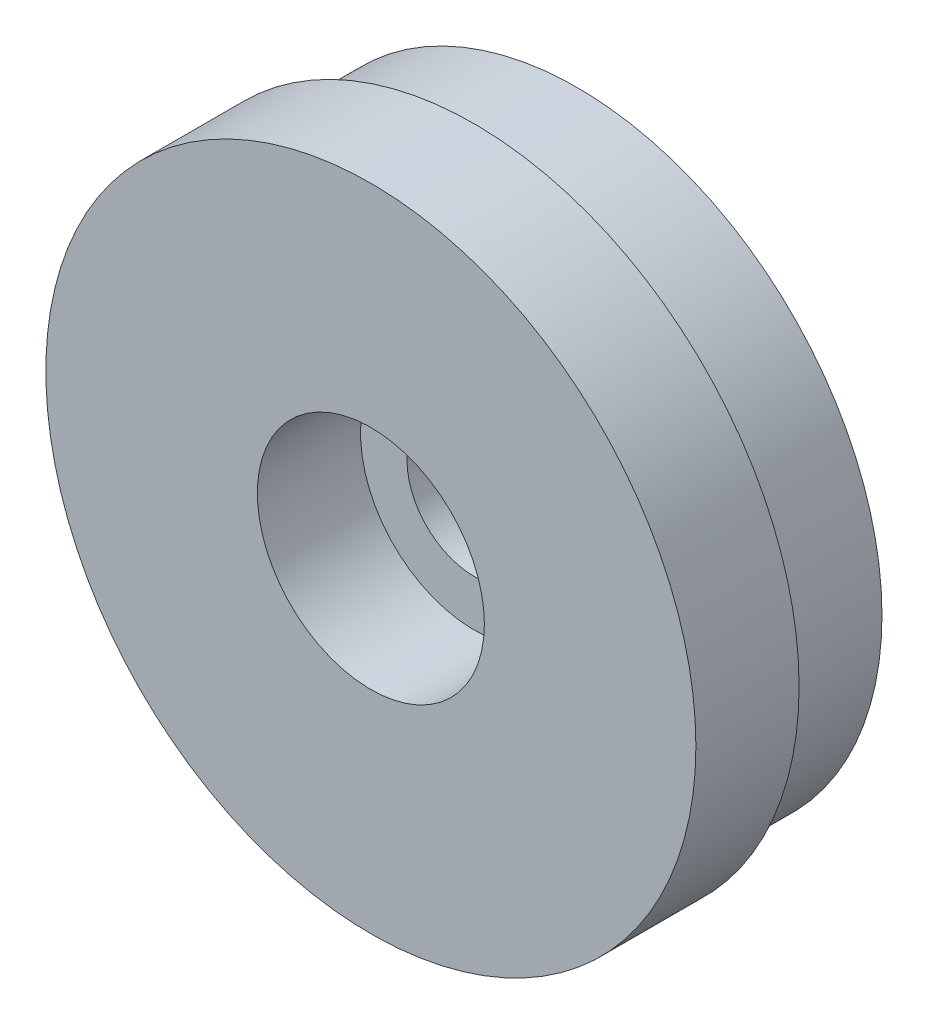
ISO-10303-21;
HEADER;
FILE_DESCRIPTION(('STEP AP214'),'2;1');
FILE_NAME('part.step','',(''),(''),'','','');
FILE_SCHEMA(('AUTOMOTIVE_DESIGN { 1 0 10303 214 1 1 1 1 }'));
ENDSEC;
DATA;
#1=APPLICATION_CONTEXT('core data for automotive mechanical design processes');
#2=APPLICATION_PROTOCOL_DEFINITION('international standard','automotive_design',2000,#1);
#3=PRODUCT_CONTEXT('',#1,'mechanical');
#4=PRODUCT('Part','Part','',(#3));
#5=PRODUCT_RELATED_PRODUCT_CATEGORY('part','',(#4));
#6=PRODUCT_DEFINITION_FORMATION('','',#4);
#7=PRODUCT_DEFINITION_CONTEXT('part definition',#1,'design');
#8=PRODUCT_DEFINITION('design','',#6,#7);
#9=PRODUCT_DEFINITION_SHAPE('','',#8);
#10=(LENGTH_UNIT() NAMED_UNIT(*) SI_UNIT(.MILLI.,.METRE.));
#11=(NAMED_UNIT(*) PLANE_ANGLE_UNIT() SI_UNIT($,.RADIAN.));
#12=(NAMED_UNIT(*) SI_UNIT($,.STERADIAN.) SOLID_ANGLE_UNIT());
#13=UNCERTAINTY_MEASURE_WITH_UNIT(LENGTH_MEASURE(1.E-05),#10,'distance_accuracy_value','');
#14=(GEOMETRIC_REPRESENTATION_CONTEXT(3) GLOBAL_UNCERTAINTY_ASSIGNED_CONTEXT((#13)) GLOBAL_UNIT_ASSIGNED_CONTEXT((#10,
#11,#12)) REPRESENTATION_CONTEXT('',''));
#15=CARTESIAN_POINT('',(0.,0.,0.));
#16=DIRECTION('',(0.,0.,1.));
#17=DIRECTION('',(1.,0.,0.));
#18=AXIS2_PLACEMENT_3D('',#15,#16,#17);
#19=CARTESIAN_POINT('',(0.,0.,-2.54));
#20=DIRECTION('',(0.,0.,1.));
#21=DIRECTION('',(1.,0.,0.));
#22=AXIS2_PLACEMENT_3D('',#19,#20,#21);
#23=CYLINDRICAL_SURFACE('',#22,8.);
#24=CARTESIAN_POINT('',(0.,0.,-2.54));
#25=DIRECTION('',(0.,0.,1.));
#26=DIRECTION('',(1.,0.,0.));
#27=AXIS2_PLACEMENT_3D('',#24,#25,#26);
#28=CIRCLE('',#27,8.);
#29=CARTESIAN_POINT('',(8.,0.,-2.54));
#30=VERTEX_POINT('',#29);
#31=EDGE_CURVE('E38',#30,#30,#28,.T.);
#32=ORIENTED_EDGE('',*,*,#31,.T.);
#33=EDGE_LOOP('',(#32));
#34=FACE_BOUND('',#33,.T.);
#35=CARTESIAN_POINT('',(0.,0.,0.));
#36=DIRECTION('',(0.,0.,1.));
#37=DIRECTION('',(1.,0.,0.));
#38=AXIS2_PLACEMENT_3D('',#35,#36,#37);
#39=CIRCLE('',#38,8.);
#40=CARTESIAN_POINT('',(8.,0.,0.));
#41=VERTEX_POINT('',#40);
#42=EDGE_CURVE('E34',#41,#41,#39,.T.);
#43=ORIENTED_EDGE('',*,*,#42,.F.);
#44=EDGE_LOOP('',(#43));
#45=FACE_BOUND('',#44,.T.);
#46=ADVANCED_FACE('F31',(#34,#45),#23,.T.);
#47=CARTESIAN_POINT('',(0.,0.,-2.54));
#48=DIRECTION('',(0.,0.,1.));
#49=DIRECTION('',(1.,0.,0.));
#50=AXIS2_PLACEMENT_3D('',#47,#48,#49);
#51=PLANE('',#50);
#52=CARTESIAN_POINT('',(0.,0.,-2.54));
#53=DIRECTION('',(0.,0.,-1.));
#54=DIRECTION('',(-1.,0.,0.));
#55=AXIS2_PLACEMENT_3D('',#52,#53,#54);
#56=CIRCLE('',#55,7.5);
#57=CARTESIAN_POINT('',(-7.5,0.,-2.54));
#58=VERTEX_POINT('',#57);
#59=EDGE_CURVE('E10',#58,#58,#56,.T.);
#60=ORIENTED_EDGE('',*,*,#59,.F.);
#61=EDGE_LOOP('',(#60));
#62=FACE_BOUND('',#61,.T.);
#63=ORIENTED_EDGE('',*,*,#31,.F.);
#64=EDGE_LOOP('',(#63));
#65=FACE_BOUND('',#64,.T.);
#66=ADVANCED_FACE('F81',(#62,#65),#51,.F.);
#67=CARTESIAN_POINT('',(0.,0.,0.));
#68=DIRECTION('',(0.,0.,1.));
#69=DIRECTION('',(1.,0.,0.));
#70=AXIS2_PLACEMENT_3D('',#67,#68,#69);
#71=PLANE('',#70);
#72=CARTESIAN_POINT('',(0.,0.,0.));
#73=DIRECTION('',(0.,0.,1.));
#74=DIRECTION('',(1.,0.,0.));
#75=AXIS2_PLACEMENT_3D('',#72,#73,#74);
#76=CIRCLE('',#75,2.794);
#77=CARTESIAN_POINT('',(2.794,0.,0.));
#78=VERTEX_POINT('',#77);
#79=EDGE_CURVE('E50',#78,#78,#76,.T.);
#80=ORIENTED_EDGE('',*,*,#79,.F.);
#81=EDGE_LOOP('',(#80));
#82=FACE_BOUND('',#81,.T.);
#83=ORIENTED_EDGE('',*,*,#42,.T.);
#84=EDGE_LOOP('',(#83));
#85=FACE_BOUND('',#84,.T.);
#86=ADVANCED_FACE('F86',(#82,#85),#71,.T.);
#87=CARTESIAN_POINT('',(0.,0.,-2.54));
#88=DIRECTION('',(0.,0.,1.));
#89=DIRECTION('',(1.,0.,0.));
#90=AXIS2_PLACEMENT_3D('',#87,#88,#89);
#91=CYLINDRICAL_SURFACE('',#90,2.794);
#92=CARTESIAN_POINT('',(0.,0.,-2.54));
#93=DIRECTION('',(0.,0.,1.));
#94=DIRECTION('',(1.,0.,0.));
#95=AXIS2_PLACEMENT_3D('',#92,#93,#94);
#96=CIRCLE('',#95,2.794);
#97=CARTESIAN_POINT('',(2.794,0.,-2.54));
#98=VERTEX_POINT('',#97);
#99=EDGE_CURVE('E47',#98,#98,#96,.T.);
#100=ORIENTED_EDGE('',*,*,#99,.F.);
#101=EDGE_LOOP('',(#100));
#102=FACE_BOUND('',#101,.T.);
#103=ORIENTED_EDGE('',*,*,#79,.T.);
#104=EDGE_LOOP('',(#103));
#105=FACE_BOUND('',#104,.T.);
#106=ADVANCED_FACE('F95',(#102,#105),#91,.F.);
#107=CARTESIAN_POINT('',(0.,0.,-2.54));
#108=DIRECTION('',(0.,0.,-1.));
#109=DIRECTION('',(-1.,0.,0.));
#110=AXIS2_PLACEMENT_3D('',#107,#108,#109);
#111=PLANE('',#110);
#112=CARTESIAN_POINT('',(0.,0.,-2.54));
#113=DIRECTION('',(0.,0.,-1.));
#114=DIRECTION('',(-1.,0.,0.));
#115=AXIS2_PLACEMENT_3D('',#112,#113,#114);
#116=CIRCLE('',#115,1.651);
#117=CARTESIAN_POINT('',(-1.651,0.,-2.54));
#118=VERTEX_POINT('',#117);
#119=EDGE_CURVE('E59',#118,#118,#116,.T.);
#120=ORIENTED_EDGE('',*,*,#119,.T.);
#121=EDGE_LOOP('',(#120));
#122=FACE_BOUND('',#121,.T.);
#123=ORIENTED_EDGE('',*,*,#99,.T.);
#124=EDGE_LOOP('',(#123));
#125=FACE_BOUND('',#124,.T.);
#126=ADVANCED_FACE('F66',(#122,#125),#111,.F.);
#127=CARTESIAN_POINT('',(0.,0.,-5.08));
#128=DIRECTION('',(0.,0.,-1.));
#129=DIRECTION('',(-1.,0.,0.));
#130=AXIS2_PLACEMENT_3D('',#127,#128,#129);
#131=PLANE('',#130);
#132=CARTESIAN_POINT('',(0.,0.,-5.08));
#133=DIRECTION('',(0.,0.,-1.));
#134=DIRECTION('',(-1.,0.,0.));
#135=AXIS2_PLACEMENT_3D('',#132,#133,#134);
#136=CIRCLE('',#135,7.5);
#137=CARTESIAN_POINT('',(-7.5,0.,-5.08));
#138=VERTEX_POINT('',#137);
#139=EDGE_CURVE('E45',#138,#138,#136,.T.);
#140=ORIENTED_EDGE('',*,*,#139,.T.);
#141=EDGE_LOOP('',(#140));
#142=FACE_BOUND('',#141,.T.);
#143=CARTESIAN_POINT('',(0.,0.,-5.08));
#144=DIRECTION('',(0.,0.,-1.));
#145=DIRECTION('',(-1.,0.,0.));
#146=AXIS2_PLACEMENT_3D('',#143,#144,#145);
#147=CIRCLE('',#146,1.651);
#148=CARTESIAN_POINT('',(-1.651,0.,-5.08));
#149=VERTEX_POINT('',#148);
#150=EDGE_CURVE('E55',#149,#149,#147,.T.);
#151=ORIENTED_EDGE('',*,*,#150,.F.);
#152=EDGE_LOOP('',(#151));
#153=FACE_BOUND('',#152,.T.);
#154=ADVANCED_FACE('F76',(#142,#153),#131,.T.);
#155=CARTESIAN_POINT('',(0.,0.,-5.08));
#156=DIRECTION('',(0.,0.,1.));
#157=DIRECTION('',(1.,0.,0.));
#158=AXIS2_PLACEMENT_3D('',#155,#156,#157);
#159=CYLINDRICAL_SURFACE('',#158,7.5);
#160=ORIENTED_EDGE('',*,*,#139,.F.);
#161=EDGE_LOOP('',(#160));
#162=FACE_BOUND('',#161,.T.);
#163=ORIENTED_EDGE('',*,*,#59,.T.);
#164=EDGE_LOOP('',(#163));
#165=FACE_BOUND('',#164,.T.);
#166=ADVANCED_FACE('F71',(#162,#165),#159,.T.);
#167=CARTESIAN_POINT('',(0.,0.,-5.08));
#168=DIRECTION('',(0.,0.,1.));
#169=DIRECTION('',(1.,0.,0.));
#170=AXIS2_PLACEMENT_3D('',#167,#168,#169);
#171=CYLINDRICAL_SURFACE('',#170,1.651);
#172=ORIENTED_EDGE('',*,*,#150,.T.);
#173=EDGE_LOOP('',(#172));
#174=FACE_BOUND('',#173,.T.);
#175=ORIENTED_EDGE('',*,*,#119,.F.);
#176=EDGE_LOOP('',(#175));
#177=FACE_BOUND('',#176,.T.);
#178=ADVANCED_FACE('F69',(#174,#177),#171,.F.);
#179=CLOSED_SHELL('',(#46,#66,#86,#106,#126,#154,#166,#178));
#180=MANIFOLD_SOLID_BREP('B2',#179);
#181=ADVANCED_BREP_SHAPE_REPRESENTATION('',(#18,#180),#14);
#182=SHAPE_DEFINITION_REPRESENTATION(#9,#181);
ENDSEC;
END-ISO-10303-21;
